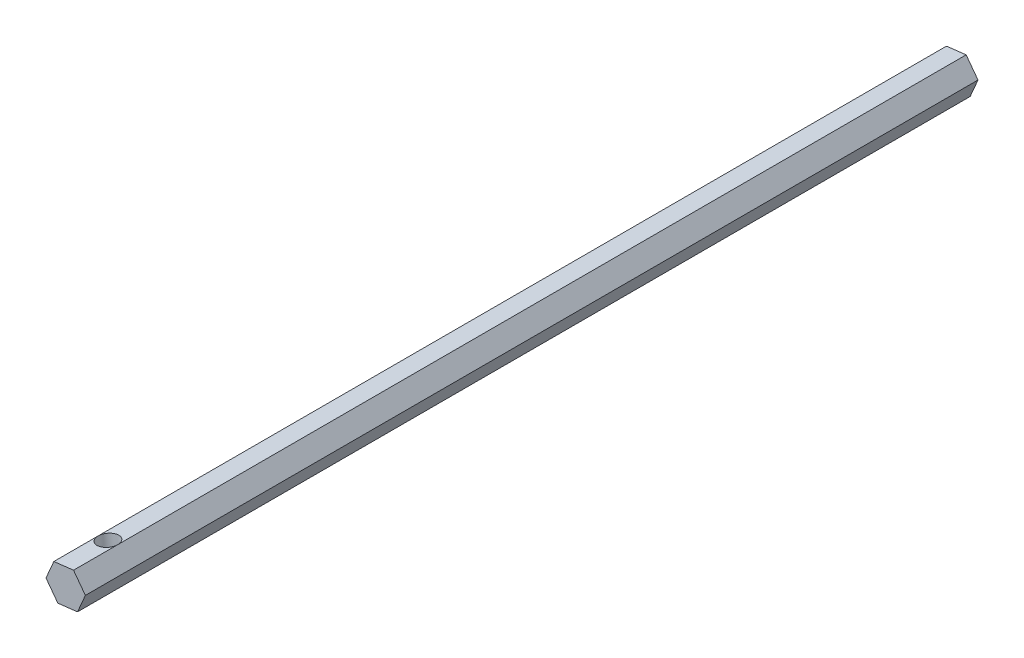
ISO-10303-21;
HEADER;
FILE_DESCRIPTION(('STEP AP214'),'2;1');
FILE_NAME('part.step','',(''),(''),'','','');
FILE_SCHEMA(('AUTOMOTIVE_DESIGN { 1 0 10303 214 1 1 1 1 }'));
ENDSEC;
DATA;
#1=APPLICATION_CONTEXT('core data for automotive mechanical design processes');
#2=APPLICATION_PROTOCOL_DEFINITION('international standard','automotive_design',2000,#1);
#3=PRODUCT_CONTEXT('',#1,'mechanical');
#4=PRODUCT('Part','Part','',(#3));
#5=PRODUCT_RELATED_PRODUCT_CATEGORY('part','',(#4));
#6=PRODUCT_DEFINITION_FORMATION('','',#4);
#7=PRODUCT_DEFINITION_CONTEXT('part definition',#1,'design');
#8=PRODUCT_DEFINITION('design','',#6,#7);
#9=PRODUCT_DEFINITION_SHAPE('','',#8);
#10=(LENGTH_UNIT() NAMED_UNIT(*) SI_UNIT(.MILLI.,.METRE.));
#11=(NAMED_UNIT(*) PLANE_ANGLE_UNIT() SI_UNIT($,.RADIAN.));
#12=(NAMED_UNIT(*) SI_UNIT($,.STERADIAN.) SOLID_ANGLE_UNIT());
#13=UNCERTAINTY_MEASURE_WITH_UNIT(LENGTH_MEASURE(1.E-05),#10,'distance_accuracy_value','');
#14=(GEOMETRIC_REPRESENTATION_CONTEXT(3) GLOBAL_UNCERTAINTY_ASSIGNED_CONTEXT((#13)) GLOBAL_UNIT_ASSIGNED_CONTEXT((#10,
#11,#12)) REPRESENTATION_CONTEXT('',''));
#15=CARTESIAN_POINT('',(0.,0.,0.));
#16=DIRECTION('',(0.,0.,1.));
#17=DIRECTION('',(1.,0.,0.));
#18=AXIS2_PLACEMENT_3D('',#15,#16,#17);
#19=CARTESIAN_POINT('',(5.80220423439102,13.4694026869797,660.4));
#20=DIRECTION('',(0.116585963589261,-0.993180604469279,0.));
#21=DIRECTION('',(0.993180604469279,0.116585963589261,0.));
#22=AXIS2_PLACEMENT_3D('',#19,#20,#21);
#23=PLANE('',#22);
#24=DIRECTION('',(0.,0.,-1.));
#25=VECTOR('',#24,1.);
#26=CARTESIAN_POINT('',(-8.76374278353125,11.7595576084181,660.4));
#27=LINE('',#26,#25);
#28=CARTESIAN_POINT('',(-8.76374278353125,11.7595576084181,627.66702));
#29=VERTEX_POINT('',#28);
#30=CARTESIAN_POINT('',(-8.76374278353125,11.7595576084181,0.));
#31=VERTEX_POINT('',#30);
#32=EDGE_CURVE('E114',#29,#31,#27,.T.);
#33=ORIENTED_EDGE('',*,*,#32,.F.);
#34=CARTESIAN_POINT('',(-1.48076927457011,12.6144801476989,627.66702));
#35=DIRECTION('',(-0.116585963589261,0.99318060446928,0.));
#36=DIRECTION('',(-0.99318060446928,-0.116585963589261,0.));
#37=AXIS2_PLACEMENT_3D('',#34,#35,#36);
#38=ELLIPSE('',#37,7.33298,7.2764254897878);
#39=CARTESIAN_POINT('',(5.80220423439102,13.4694026869797,627.66702));
#40=VERTEX_POINT('',#39);
#41=EDGE_CURVE('E54',#40,#29,#38,.T.);
#42=ORIENTED_EDGE('',*,*,#41,.F.);
#43=DIRECTION('',(0.,0.,-1.));
#44=VECTOR('',#43,1.);
#45=CARTESIAN_POINT('',(5.80220423439102,13.4694026869797,660.4));
#46=LINE('',#45,#44);
#47=CARTESIAN_POINT('',(5.80220423439102,13.4694026869797,0.));
#48=VERTEX_POINT('',#47);
#49=EDGE_CURVE('E48',#40,#48,#46,.T.);
#50=ORIENTED_EDGE('',*,*,#49,.T.);
#51=DIRECTION('',(-0.993180604469279,-0.116585963589261,0.));
#52=VECTOR('',#51,1.);
#53=CARTESIAN_POINT('',(5.80220423439102,13.4694026869797,0.));
#54=LINE('',#53,#52);
#55=EDGE_CURVE('E160',#48,#31,#54,.T.);
#56=ORIENTED_EDGE('',*,*,#55,.T.);
#57=EDGE_LOOP('',(#33,#42,#50,#56));
#58=FACE_BOUND('',#57,.T.);
#59=ADVANCED_FACE('F39',(#58),#23,.F.);
#60=CARTESIAN_POINT('',(-5.80220423439101,-13.4694026869797,660.4));
#61=DIRECTION('',(-0.116585963589262,0.993180604469279,0.));
#62=DIRECTION('',(-0.993180604469279,-0.116585963589262,0.));
#63=AXIS2_PLACEMENT_3D('',#60,#61,#62);
#64=PLANE('',#63);
#65=DIRECTION('',(0.,0.,-1.));
#66=VECTOR('',#65,1.);
#67=CARTESIAN_POINT('',(-5.80220423439101,-13.4694026869797,660.4));
#68=LINE('',#67,#66);
#69=CARTESIAN_POINT('',(-5.80220423439101,-13.4694026869797,660.4));
#70=VERTEX_POINT('',#69);
#71=CARTESIAN_POINT('',(-5.80220423439102,-13.4694026869797,627.66702));
#72=VERTEX_POINT('',#71);
#73=EDGE_CURVE('E181',#70,#72,#68,.T.);
#74=ORIENTED_EDGE('',*,*,#73,.T.);
#75=CARTESIAN_POINT('',(1.48076927457012,-12.6144801476989,627.66702));
#76=DIRECTION('',(-0.116585963589261,0.99318060446928,0.));
#77=DIRECTION('',(-0.99318060446928,-0.116585963589261,0.));
#78=AXIS2_PLACEMENT_3D('',#75,#76,#77);
#79=ELLIPSE('',#78,7.33298,7.2764254897878);
#80=CARTESIAN_POINT('',(8.76374278353125,-11.7595576084181,627.66702));
#81=VERTEX_POINT('',#80);
#82=EDGE_CURVE('E61',#72,#81,#79,.T.);
#83=ORIENTED_EDGE('',*,*,#82,.T.);
#84=DIRECTION('',(0.,0.,-1.));
#85=VECTOR('',#84,1.);
#86=CARTESIAN_POINT('',(8.76374278353125,-11.7595576084181,660.4));
#87=LINE('',#86,#85);
#88=CARTESIAN_POINT('',(8.76374278353125,-11.7595576084181,660.4));
#89=VERTEX_POINT('',#88);
#90=EDGE_CURVE('E176',#89,#81,#87,.T.);
#91=ORIENTED_EDGE('',*,*,#90,.F.);
#92=DIRECTION('',(0.993180604469279,0.116585963589262,0.));
#93=VECTOR('',#92,1.);
#94=CARTESIAN_POINT('',(-5.80220423439101,-13.4694026869797,660.4));
#95=LINE('',#94,#93);
#96=EDGE_CURVE('E152',#70,#89,#95,.T.);
#97=ORIENTED_EDGE('',*,*,#96,.F.);
#98=EDGE_LOOP('',(#74,#83,#91,#97));
#99=FACE_BOUND('',#98,.T.);
#100=ADVANCED_FACE('F207',(#99),#64,.F.);
#101=CARTESIAN_POINT('',(14.5659470179223,1.70984507856157,660.4));
#102=DIRECTION('',(-0.80182665222175,-0.597556708427628,0.));
#103=DIRECTION('',(0.597556708427628,-0.80182665222175,0.));
#104=AXIS2_PLACEMENT_3D('',#101,#102,#103);
#105=PLANE('',#104);
#106=DIRECTION('',(-0.597556708427628,0.80182665222175,0.));
#107=VECTOR('',#106,1.);
#108=CARTESIAN_POINT('',(14.5659470179223,1.70984507856157,0.));
#109=LINE('',#108,#107);
#110=CARTESIAN_POINT('',(14.5659470179223,1.70984507856157,0.));
#111=VERTEX_POINT('',#110);
#112=EDGE_CURVE('E123',#111,#48,#109,.T.);
#113=ORIENTED_EDGE('',*,*,#112,.T.);
#114=ORIENTED_EDGE('',*,*,#49,.F.);
#115=CARTESIAN_POINT('',(5.80220423439102,13.4694026869797,660.4));
#116=VERTEX_POINT('',#115);
#117=EDGE_CURVE('E11',#116,#40,#46,.T.);
#118=ORIENTED_EDGE('',*,*,#117,.F.);
#119=DIRECTION('',(-0.597556708427628,0.80182665222175,0.));
#120=VECTOR('',#119,1.);
#121=CARTESIAN_POINT('',(14.5659470179223,1.70984507856157,660.4));
#122=LINE('',#121,#120);
#123=CARTESIAN_POINT('',(14.5659470179223,1.70984507856157,660.4));
#124=VERTEX_POINT('',#123);
#125=EDGE_CURVE('E133',#124,#116,#122,.T.);
#126=ORIENTED_EDGE('',*,*,#125,.F.);
#127=DIRECTION('',(0.,0.,-1.));
#128=VECTOR('',#127,1.);
#129=CARTESIAN_POINT('',(14.5659470179223,1.70984507856157,660.4));
#130=LINE('',#129,#128);
#131=EDGE_CURVE('E157',#124,#111,#130,.T.);
#132=ORIENTED_EDGE('',*,*,#131,.T.);
#133=EDGE_LOOP('',(#113,#114,#118,#126,#132));
#134=FACE_BOUND('',#133,.T.);
#135=ADVANCED_FACE('F41',(#134),#105,.F.);
#136=ORIENTED_EDGE('',*,*,#117,.T.);
#137=EDGE_CURVE('E102',#29,#40,#38,.T.);
#138=ORIENTED_EDGE('',*,*,#137,.F.);
#139=CARTESIAN_POINT('',(-8.76374278353125,11.7595576084181,660.4));
#140=VERTEX_POINT('',#139);
#141=EDGE_CURVE('E125',#140,#29,#27,.T.);
#142=ORIENTED_EDGE('',*,*,#141,.F.);
#143=DIRECTION('',(-0.993180604469279,-0.116585963589261,0.));
#144=VECTOR('',#143,1.);
#145=CARTESIAN_POINT('',(5.80220423439102,13.4694026869797,660.4));
#146=LINE('',#145,#144);
#147=EDGE_CURVE('E127',#116,#140,#146,.T.);
#148=ORIENTED_EDGE('',*,*,#147,.F.);
#149=EDGE_LOOP('',(#136,#138,#142,#148));
#150=FACE_BOUND('',#149,.T.);
#151=ADVANCED_FACE('F126',(#150),#23,.F.);
#152=CARTESIAN_POINT('',(-8.76374278353125,11.7595576084181,660.4));
#153=DIRECTION('',(0.918412615811012,-0.395623896041651,0.));
#154=DIRECTION('',(0.395623896041651,0.918412615811012,0.));
#155=AXIS2_PLACEMENT_3D('',#152,#153,#154);
#156=PLANE('',#155);
#157=DIRECTION('',(-0.395623896041651,-0.918412615811012,0.));
#158=VECTOR('',#157,1.);
#159=CARTESIAN_POINT('',(-8.76374278353125,11.7595576084181,0.));
#160=LINE('',#159,#158);
#161=CARTESIAN_POINT('',(-14.5659470179223,-1.70984507856157,0.));
#162=VERTEX_POINT('',#161);
#163=EDGE_CURVE('E163',#31,#162,#160,.T.);
#164=ORIENTED_EDGE('',*,*,#163,.T.);
#165=DIRECTION('',(0.,0.,-1.));
#166=VECTOR('',#165,1.);
#167=CARTESIAN_POINT('',(-14.5659470179223,-1.70984507856157,660.4));
#168=LINE('',#167,#166);
#169=CARTESIAN_POINT('',(-14.5659470179223,-1.70984507856157,660.4));
#170=VERTEX_POINT('',#169);
#171=EDGE_CURVE('E185',#170,#162,#168,.T.);
#172=ORIENTED_EDGE('',*,*,#171,.F.);
#173=DIRECTION('',(-0.395623896041651,-0.918412615811012,0.));
#174=VECTOR('',#173,1.);
#175=CARTESIAN_POINT('',(-8.76374278353125,11.7595576084181,660.4));
#176=LINE('',#175,#174);
#177=EDGE_CURVE('E132',#140,#170,#176,.T.);
#178=ORIENTED_EDGE('',*,*,#177,.F.);
#179=ORIENTED_EDGE('',*,*,#141,.T.);
#180=ORIENTED_EDGE('',*,*,#32,.T.);
#181=EDGE_LOOP('',(#164,#172,#178,#179,#180));
#182=FACE_BOUND('',#181,.T.);
#183=ADVANCED_FACE('F191',(#182),#156,.F.);
#184=CARTESIAN_POINT('',(-14.5659470179223,-1.70984507856157,660.4));
#185=DIRECTION('',(0.80182665222175,0.597556708427628,0.));
#186=DIRECTION('',(-0.597556708427628,0.80182665222175,0.));
#187=AXIS2_PLACEMENT_3D('',#184,#185,#186);
#188=PLANE('',#187);
#189=DIRECTION('',(0.597556708427628,-0.80182665222175,0.));
#190=VECTOR('',#189,1.);
#191=CARTESIAN_POINT('',(-14.5659470179223,-1.70984507856157,0.));
#192=LINE('',#191,#190);
#193=CARTESIAN_POINT('',(-5.80220423439101,-13.4694026869797,0.));
#194=VERTEX_POINT('',#193);
#195=EDGE_CURVE('E166',#162,#194,#192,.T.);
#196=ORIENTED_EDGE('',*,*,#195,.T.);
#197=EDGE_CURVE('E180',#72,#194,#68,.T.);
#198=ORIENTED_EDGE('',*,*,#197,.F.);
#199=ORIENTED_EDGE('',*,*,#73,.F.);
#200=DIRECTION('',(0.597556708427628,-0.80182665222175,0.));
#201=VECTOR('',#200,1.);
#202=CARTESIAN_POINT('',(-14.5659470179223,-1.70984507856157,660.4));
#203=LINE('',#202,#201);
#204=EDGE_CURVE('E149',#170,#70,#203,.T.);
#205=ORIENTED_EDGE('',*,*,#204,.F.);
#206=ORIENTED_EDGE('',*,*,#171,.T.);
#207=EDGE_LOOP('',(#196,#198,#199,#205,#206));
#208=FACE_BOUND('',#207,.T.);
#209=ADVANCED_FACE('F201',(#208),#188,.F.);
#210=CARTESIAN_POINT('',(8.76374278353125,-11.7595576084181,0.));
#211=VERTEX_POINT('',#210);
#212=EDGE_CURVE('E175',#81,#211,#87,.T.);
#213=ORIENTED_EDGE('',*,*,#212,.F.);
#214=EDGE_CURVE('E108',#81,#72,#79,.T.);
#215=ORIENTED_EDGE('',*,*,#214,.T.);
#216=ORIENTED_EDGE('',*,*,#197,.T.);
#217=DIRECTION('',(0.993180604469279,0.116585963589262,0.));
#218=VECTOR('',#217,1.);
#219=CARTESIAN_POINT('',(-5.80220423439101,-13.4694026869797,0.));
#220=LINE('',#219,#218);
#221=EDGE_CURVE('E143',#194,#211,#220,.T.);
#222=ORIENTED_EDGE('',*,*,#221,.T.);
#223=EDGE_LOOP('',(#213,#215,#216,#222));
#224=FACE_BOUND('',#223,.T.);
#225=ADVANCED_FACE('F213',(#224),#64,.F.);
#226=CARTESIAN_POINT('',(8.76374278353125,-11.7595576084181,660.4));
#227=DIRECTION('',(-0.918412615811012,0.395623896041651,0.));
#228=DIRECTION('',(-0.395623896041651,-0.918412615811012,0.));
#229=AXIS2_PLACEMENT_3D('',#226,#227,#228);
#230=PLANE('',#229);
#231=DIRECTION('',(0.395623896041651,0.918412615811011,0.));
#232=VECTOR('',#231,1.);
#233=CARTESIAN_POINT('',(8.76374278353125,-11.7595576084181,0.));
#234=LINE('',#233,#232);
#235=EDGE_CURVE('E140',#211,#111,#234,.T.);
#236=ORIENTED_EDGE('',*,*,#235,.T.);
#237=ORIENTED_EDGE('',*,*,#131,.F.);
#238=DIRECTION('',(0.395623896041651,0.918412615811011,0.));
#239=VECTOR('',#238,1.);
#240=CARTESIAN_POINT('',(8.76374278353125,-11.7595576084181,660.4));
#241=LINE('',#240,#239);
#242=EDGE_CURVE('E137',#89,#124,#241,.T.);
#243=ORIENTED_EDGE('',*,*,#242,.F.);
#244=ORIENTED_EDGE('',*,*,#90,.T.);
#245=ORIENTED_EDGE('',*,*,#212,.T.);
#246=EDGE_LOOP('',(#236,#237,#243,#244,#245));
#247=FACE_BOUND('',#246,.T.);
#248=ADVANCED_FACE('F210',(#247),#230,.F.);
#249=CARTESIAN_POINT('',(0.,0.,660.4));
#250=DIRECTION('',(0.,0.,1.));
#251=DIRECTION('',(1.,0.,0.));
#252=AXIS2_PLACEMENT_3D('',#249,#250,#251);
#253=PLANE('',#252);
#254=ORIENTED_EDGE('',*,*,#125,.T.);
#255=ORIENTED_EDGE('',*,*,#147,.T.);
#256=ORIENTED_EDGE('',*,*,#177,.T.);
#257=ORIENTED_EDGE('',*,*,#204,.T.);
#258=ORIENTED_EDGE('',*,*,#96,.T.);
#259=ORIENTED_EDGE('',*,*,#242,.T.);
#260=EDGE_LOOP('',(#254,#255,#256,#257,#258,#259));
#261=FACE_BOUND('',#260,.T.);
#262=ADVANCED_FACE('F135',(#261),#253,.T.);
#263=CARTESIAN_POINT('',(0.,0.,0.));
#264=DIRECTION('',(0.,0.,1.));
#265=DIRECTION('',(1.,0.,0.));
#266=AXIS2_PLACEMENT_3D('',#263,#264,#265);
#267=PLANE('',#266);
#268=ORIENTED_EDGE('',*,*,#112,.F.);
#269=ORIENTED_EDGE('',*,*,#235,.F.);
#270=ORIENTED_EDGE('',*,*,#221,.F.);
#271=ORIENTED_EDGE('',*,*,#195,.F.);
#272=ORIENTED_EDGE('',*,*,#163,.F.);
#273=ORIENTED_EDGE('',*,*,#55,.F.);
#274=EDGE_LOOP('',(#268,#269,#270,#271,#272,#273));
#275=FACE_BOUND('',#274,.T.);
#276=ADVANCED_FACE('F196',(#275),#267,.F.);
#277=CARTESIAN_POINT('',(2.36889924314728,-20.1803434118766,627.66702));
#278=DIRECTION('',(-0.116585963589261,0.99318060446928,0.));
#279=DIRECTION('',(-0.99318060446928,-0.116585963589261,0.));
#280=AXIS2_PLACEMENT_3D('',#277,#278,#279);
#281=ELLIPSE('',#280,7.33298,7.2764254897878);
#282=DIRECTION('',(-0.116585963589261,0.99318060446928,0.));
#283=VECTOR('',#282,1.);
#284=SURFACE_OF_LINEAR_EXTRUSION('',#281,#283);
#285=ORIENTED_EDGE('',*,*,#137,.T.);
#286=ORIENTED_EDGE('',*,*,#41,.T.);
#287=EDGE_LOOP('',(#285,#286));
#288=FACE_BOUND('',#287,.T.);
#289=ORIENTED_EDGE('',*,*,#214,.F.);
#290=ORIENTED_EDGE('',*,*,#82,.F.);
#291=EDGE_LOOP('',(#289,#290));
#292=FACE_BOUND('',#291,.T.);
#293=ADVANCED_FACE('F103',(#288,#292),#284,.F.);
#294=CLOSED_SHELL('',(#59,#100,#135,#151,#183,#209,#225,#248,#262,#276,#293));
#295=MANIFOLD_SOLID_BREP('B2',#294);
#296=ADVANCED_BREP_SHAPE_REPRESENTATION('',(#18,#295),#14);
#297=SHAPE_DEFINITION_REPRESENTATION(#9,#296);
ENDSEC;
END-ISO-10303-21;
